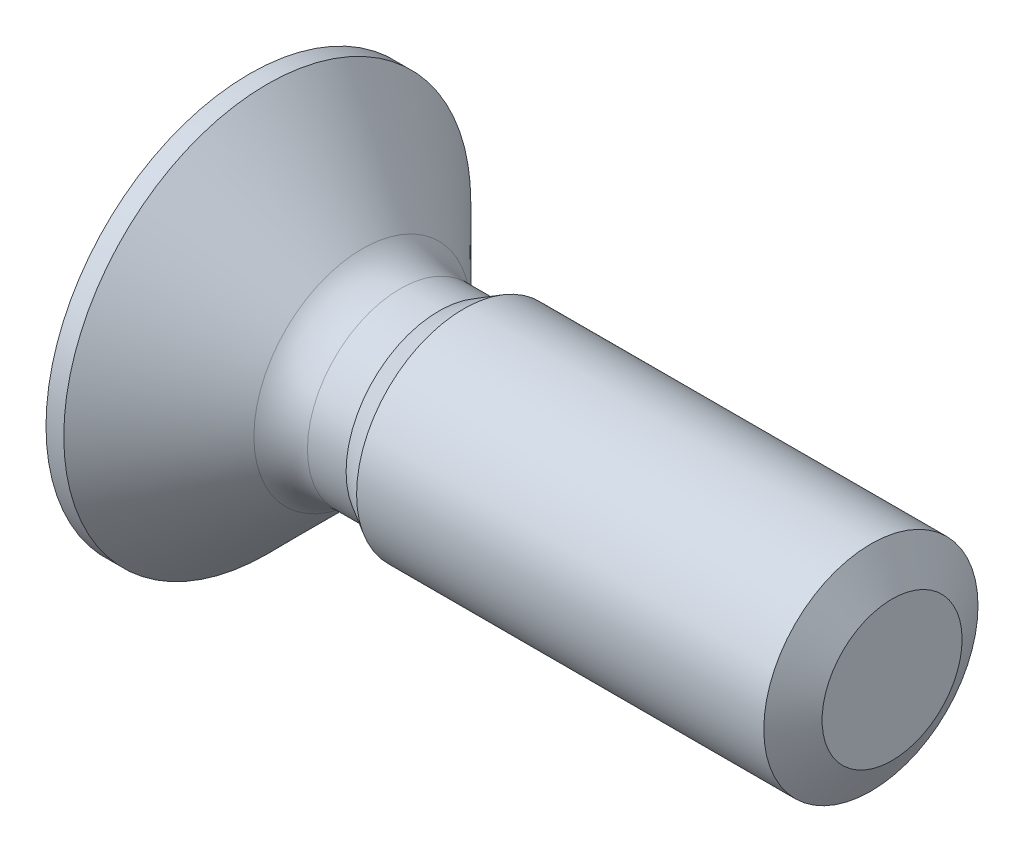
ISO-10303-21;
HEADER;
FILE_DESCRIPTION(('STEP AP214'),'2;1');
FILE_NAME('part.step','',(''),(''),'','','');
FILE_SCHEMA(('AUTOMOTIVE_DESIGN { 1 0 10303 214 1 1 1 1 }'));
ENDSEC;
DATA;
#1=APPLICATION_CONTEXT('core data for automotive mechanical design processes');
#2=APPLICATION_PROTOCOL_DEFINITION('international standard','automotive_design',2000,#1);
#3=PRODUCT_CONTEXT('',#1,'mechanical');
#4=PRODUCT('Part','Part','',(#3));
#5=PRODUCT_RELATED_PRODUCT_CATEGORY('part','',(#4));
#6=PRODUCT_DEFINITION_FORMATION('','',#4);
#7=PRODUCT_DEFINITION_CONTEXT('part definition',#1,'design');
#8=PRODUCT_DEFINITION('design','',#6,#7);
#9=PRODUCT_DEFINITION_SHAPE('','',#8);
#10=(LENGTH_UNIT() NAMED_UNIT(*) SI_UNIT(.MILLI.,.METRE.));
#11=(NAMED_UNIT(*) PLANE_ANGLE_UNIT() SI_UNIT($,.RADIAN.));
#12=(NAMED_UNIT(*) SI_UNIT($,.STERADIAN.) SOLID_ANGLE_UNIT());
#13=UNCERTAINTY_MEASURE_WITH_UNIT(LENGTH_MEASURE(1.E-05),#10,'distance_accuracy_value','');
#14=(GEOMETRIC_REPRESENTATION_CONTEXT(3) GLOBAL_UNCERTAINTY_ASSIGNED_CONTEXT((#13)) GLOBAL_UNIT_ASSIGNED_CONTEXT((#10,
#11,#12)) REPRESENTATION_CONTEXT('',''));
#15=CARTESIAN_POINT('',(0.,0.,0.));
#16=DIRECTION('',(0.,0.,1.));
#17=DIRECTION('',(1.,0.,0.));
#18=AXIS2_PLACEMENT_3D('',#15,#16,#17);
#19=CARTESIAN_POINT('',(0.,0.,0.));
#20=DIRECTION('',(1.,0.,0.));
#21=DIRECTION('',(0.,0.,-1.));
#22=AXIS2_PLACEMENT_3D('',#19,#20,#21);
#23=PLANE('',#22);
#24=CARTESIAN_POINT('',(0.,0.,0.));
#25=DIRECTION('',(-1.,0.,0.));
#26=DIRECTION('',(0.,0.,1.));
#27=AXIS2_PLACEMENT_3D('',#24,#25,#26);
#28=CIRCLE('',#27,1.9);
#29=CARTESIAN_POINT('',(0.,0.,1.9));
#30=VERTEX_POINT('',#29);
#31=EDGE_CURVE('E183',#30,#30,#28,.T.);
#32=ORIENTED_EDGE('',*,*,#31,.T.);
#33=EDGE_LOOP('',(#32));
#34=FACE_BOUND('',#33,.T.);
#35=DIRECTION('',(0.,1.,0.));
#36=VECTOR('',#35,1.);
#37=CARTESIAN_POINT('',(0.,0.95,0.200000000000003));
#38=LINE('',#37,#36);
#39=CARTESIAN_POINT('',(0.,0.2,0.200000000000001));
#40=VERTEX_POINT('',#39);
#41=CARTESIAN_POINT('',(0.,0.95,0.200000000000003));
#42=VERTEX_POINT('',#41);
#43=EDGE_CURVE('E105',#40,#42,#38,.T.);
#44=ORIENTED_EDGE('',*,*,#43,.F.);
#45=DIRECTION('',(0.,0.,-1.));
#46=VECTOR('',#45,1.);
#47=CARTESIAN_POINT('',(0.,0.2,-0.95));
#48=LINE('',#47,#46);
#49=CARTESIAN_POINT('',(0.,0.2,0.95));
#50=VERTEX_POINT('',#49);
#51=EDGE_CURVE('E150',#50,#40,#48,.T.);
#52=ORIENTED_EDGE('',*,*,#51,.F.);
#53=DIRECTION('',(0.,1.,0.));
#54=VECTOR('',#53,1.);
#55=CARTESIAN_POINT('',(0.,0.2,0.95));
#56=LINE('',#55,#54);
#57=CARTESIAN_POINT('',(0.,-0.2,0.95));
#58=VERTEX_POINT('',#57);
#59=EDGE_CURVE('E147',#58,#50,#56,.T.);
#60=ORIENTED_EDGE('',*,*,#59,.F.);
#61=DIRECTION('',(0.,0.,1.));
#62=VECTOR('',#61,1.);
#63=CARTESIAN_POINT('',(0.,-0.2,-0.95));
#64=LINE('',#63,#62);
#65=CARTESIAN_POINT('',(0.,-0.2,0.199999999999999));
#66=VERTEX_POINT('',#65);
#67=EDGE_CURVE('E78',#66,#58,#64,.T.);
#68=ORIENTED_EDGE('',*,*,#67,.F.);
#69=CARTESIAN_POINT('',(0.,-0.950000000000001,0.199999999999997));
#70=VERTEX_POINT('',#69);
#71=EDGE_CURVE('E113',#70,#66,#38,.T.);
#72=ORIENTED_EDGE('',*,*,#71,.F.);
#73=DIRECTION('',(0.,0.,1.));
#74=VECTOR('',#73,1.);
#75=CARTESIAN_POINT('',(0.,-0.950000000000001,0.199999999999997));
#76=LINE('',#75,#74);
#77=CARTESIAN_POINT('',(0.,-0.95,-0.200000000000003));
#78=VERTEX_POINT('',#77);
#79=EDGE_CURVE('E114',#78,#70,#76,.T.);
#80=ORIENTED_EDGE('',*,*,#79,.F.);
#81=DIRECTION('',(0.,-1.,0.));
#82=VECTOR('',#81,1.);
#83=CARTESIAN_POINT('',(0.,0.950000000000001,-0.199999999999997));
#84=LINE('',#83,#82);
#85=CARTESIAN_POINT('',(0.,-0.2,-0.200000000000001));
#86=VERTEX_POINT('',#85);
#87=EDGE_CURVE('E127',#86,#78,#84,.T.);
#88=ORIENTED_EDGE('',*,*,#87,.F.);
#89=CARTESIAN_POINT('',(0.,-0.2,-0.95));
#90=VERTEX_POINT('',#89);
#91=EDGE_CURVE('E144',#90,#86,#64,.T.);
#92=ORIENTED_EDGE('',*,*,#91,.F.);
#93=DIRECTION('',(0.,-1.,0.));
#94=VECTOR('',#93,1.);
#95=CARTESIAN_POINT('',(0.,0.2,-0.95));
#96=LINE('',#95,#94);
#97=CARTESIAN_POINT('',(0.,0.2,-0.95));
#98=VERTEX_POINT('',#97);
#99=EDGE_CURVE('E55',#98,#90,#96,.T.);
#100=ORIENTED_EDGE('',*,*,#99,.F.);
#101=CARTESIAN_POINT('',(0.,0.2,-0.199999999999999));
#102=VERTEX_POINT('',#101);
#103=EDGE_CURVE('E153',#102,#98,#48,.T.);
#104=ORIENTED_EDGE('',*,*,#103,.F.);
#105=CARTESIAN_POINT('',(0.,0.950000000000001,-0.199999999999997));
#106=VERTEX_POINT('',#105);
#107=EDGE_CURVE('E126',#106,#102,#84,.T.);
#108=ORIENTED_EDGE('',*,*,#107,.F.);
#109=DIRECTION('',(0.,0.,-1.));
#110=VECTOR('',#109,1.);
#111=CARTESIAN_POINT('',(0.,0.95,0.200000000000003));
#112=LINE('',#111,#110);
#113=EDGE_CURVE('E119',#42,#106,#112,.T.);
#114=ORIENTED_EDGE('',*,*,#113,.F.);
#115=EDGE_LOOP('',(#44,#52,#60,#68,#72,#80,#88,#92,#100,#104,#108,#114));
#116=FACE_BOUND('',#115,.T.);
#117=ADVANCED_FACE('F41',(#34,#116),#23,.F.);
#118=CARTESIAN_POINT('',(1.2,0.,0.));
#119=DIRECTION('',(-0.164398987305357,-0.986393923832144,0.));
#120=DIRECTION('',(0.986393923832144,-0.164398987305357,0.));
#121=AXIS2_PLACEMENT_3D('',#118,#119,#120);
#122=PLANE('',#121);
#123=ORIENTED_EDGE('',*,*,#51,.T.);
#124=DIRECTION('',(0.973328526784575,-0.162221421130763,-0.162221421130763));
#125=VECTOR('',#124,1.);
#126=CARTESIAN_POINT('',(1.2,0.,0.));
#127=LINE('',#126,#125);
#128=CARTESIAN_POINT('',(1.2,0.,0.));
#129=VERTEX_POINT('',#128);
#130=EDGE_CURVE('E84',#40,#129,#127,.T.);
#131=ORIENTED_EDGE('',*,*,#130,.T.);
#132=DIRECTION('',(0.777436258070084,-0.129572709678347,-0.61547037097215));
#133=VECTOR('',#132,1.);
#134=CARTESIAN_POINT('',(0.,0.2,0.95));
#135=LINE('',#134,#133);
#136=EDGE_CURVE('E64',#50,#129,#135,.T.);
#137=ORIENTED_EDGE('',*,*,#136,.F.);
#138=EDGE_LOOP('',(#123,#131,#137));
#139=FACE_BOUND('',#138,.T.);
#140=ADVANCED_FACE('F199',(#139),#122,.T.);
#141=DIRECTION('',(0.777436258070084,-0.129572709678347,0.61547037097215));
#142=VECTOR('',#141,1.);
#143=CARTESIAN_POINT('',(0.,0.2,-0.95));
#144=LINE('',#143,#142);
#145=EDGE_CURVE('E149',#98,#129,#144,.T.);
#146=ORIENTED_EDGE('',*,*,#145,.T.);
#147=DIRECTION('',(-0.973328526784575,0.162221421130763,-0.162221421130762));
#148=VECTOR('',#147,1.);
#149=CARTESIAN_POINT('',(1.2,0.,0.));
#150=LINE('',#149,#148);
#151=EDGE_CURVE('E131',#129,#102,#150,.T.);
#152=ORIENTED_EDGE('',*,*,#151,.T.);
#153=ORIENTED_EDGE('',*,*,#103,.T.);
#154=EDGE_LOOP('',(#146,#152,#153));
#155=FACE_BOUND('',#154,.T.);
#156=ADVANCED_FACE('F193',(#155),#122,.T.);
#157=CARTESIAN_POINT('',(1.2,0.,0.));
#158=DIRECTION('',(-0.164398987305357,0.986393923832144,0.));
#159=DIRECTION('',(-0.986393923832144,-0.164398987305357,0.));
#160=AXIS2_PLACEMENT_3D('',#157,#158,#159);
#161=PLANE('',#160);
#162=DIRECTION('',(0.777436258070084,0.129572709678347,-0.61547037097215));
#163=VECTOR('',#162,1.);
#164=CARTESIAN_POINT('',(0.,-0.2,0.95));
#165=LINE('',#164,#163);
#166=EDGE_CURVE('E143',#58,#129,#165,.T.);
#167=ORIENTED_EDGE('',*,*,#166,.T.);
#168=DIRECTION('',(-0.973328526784575,-0.162221421130763,0.162221421130762));
#169=VECTOR('',#168,1.);
#170=CARTESIAN_POINT('',(1.2,0.,0.));
#171=LINE('',#170,#169);
#172=EDGE_CURVE('E11',#129,#66,#171,.T.);
#173=ORIENTED_EDGE('',*,*,#172,.T.);
#174=ORIENTED_EDGE('',*,*,#67,.T.);
#175=EDGE_LOOP('',(#167,#173,#174));
#176=FACE_BOUND('',#175,.T.);
#177=ADVANCED_FACE('F194',(#176),#161,.T.);
#178=ORIENTED_EDGE('',*,*,#91,.T.);
#179=DIRECTION('',(0.973328526784575,0.162221421130763,0.162221421130763));
#180=VECTOR('',#179,1.);
#181=CARTESIAN_POINT('',(1.2,0.,0.));
#182=LINE('',#181,#180);
#183=EDGE_CURVE('E48',#86,#129,#182,.T.);
#184=ORIENTED_EDGE('',*,*,#183,.T.);
#185=DIRECTION('',(0.777436258070084,0.129572709678347,0.61547037097215));
#186=VECTOR('',#185,1.);
#187=CARTESIAN_POINT('',(0.,-0.2,-0.95));
#188=LINE('',#187,#186);
#189=EDGE_CURVE('E158',#90,#129,#188,.T.);
#190=ORIENTED_EDGE('',*,*,#189,.F.);
#191=EDGE_LOOP('',(#178,#184,#190));
#192=FACE_BOUND('',#191,.T.);
#193=ADVANCED_FACE('F187',(#192),#161,.T.);
#194=CARTESIAN_POINT('',(0.,0.,0.));
#195=DIRECTION('',(-1.,0.,0.));
#196=DIRECTION('',(0.,0.,1.));
#197=AXIS2_PLACEMENT_3D('',#194,#195,#196);
#198=CYLINDRICAL_SURFACE('',#197,1.9);
#199=ORIENTED_EDGE('',*,*,#31,.F.);
#200=EDGE_LOOP('',(#199));
#201=FACE_BOUND('',#200,.T.);
#202=CARTESIAN_POINT('',(0.166000000000004,0.,0.));
#203=DIRECTION('',(-1.,0.,0.));
#204=DIRECTION('',(0.,0.,1.));
#205=AXIS2_PLACEMENT_3D('',#202,#203,#204);
#206=CIRCLE('',#205,1.9);
#207=CARTESIAN_POINT('',(0.166000000000004,0.,1.9));
#208=VERTEX_POINT('',#207);
#209=EDGE_CURVE('E179',#208,#208,#206,.T.);
#210=ORIENTED_EDGE('',*,*,#209,.T.);
#211=EDGE_LOOP('',(#210));
#212=FACE_BOUND('',#211,.T.);
#213=ADVANCED_FACE('F227',(#201,#212),#198,.T.);
#214=CARTESIAN_POINT('',(1.05355339059327,0.,0.));
#215=DIRECTION('',(-1.,0.,0.));
#216=DIRECTION('',(0.,0.,1.));
#217=AXIS2_PLACEMENT_3D('',#214,#215,#216);
#218=CONICAL_SURFACE('',#217,1.01244660940673,0.78539816339745);
#219=ORIENTED_EDGE('',*,*,#209,.F.);
#220=EDGE_LOOP('',(#219));
#221=FACE_BOUND('',#220,.T.);
#222=CARTESIAN_POINT('',(1.05355339059327,0.,0.));
#223=DIRECTION('',(-1.,0.,0.));
#224=DIRECTION('',(0.,0.,1.));
#225=AXIS2_PLACEMENT_3D('',#222,#223,#224);
#226=CIRCLE('',#225,1.01244660940673);
#227=CARTESIAN_POINT('',(1.05355339059327,0.,1.01244660940673));
#228=VERTEX_POINT('',#227);
#229=EDGE_CURVE('E175',#228,#228,#226,.T.);
#230=ORIENTED_EDGE('',*,*,#229,.T.);
#231=EDGE_LOOP('',(#230));
#232=FACE_BOUND('',#231,.T.);
#233=ADVANCED_FACE('F230',(#221,#232),#218,.T.);
#234=CARTESIAN_POINT('',(1.40710678118655,0.,0.));
#235=DIRECTION('',(-1.,0.,0.));
#236=DIRECTION('',(0.,0.,1.));
#237=AXIS2_PLACEMENT_3D('',#234,#235,#236);
#238=TOROIDAL_SURFACE('',#237,1.366,0.5);
#239=ORIENTED_EDGE('',*,*,#229,.F.);
#240=EDGE_LOOP('',(#239));
#241=FACE_BOUND('',#240,.T.);
#242=CARTESIAN_POINT('',(1.40710678118655,0.,0.));
#243=DIRECTION('',(-1.,0.,0.));
#244=DIRECTION('',(0.,0.,1.));
#245=AXIS2_PLACEMENT_3D('',#242,#243,#244);
#246=CIRCLE('',#245,0.866);
#247=CARTESIAN_POINT('',(1.40710678118655,0.,0.866));
#248=VERTEX_POINT('',#247);
#249=EDGE_CURVE('E172',#248,#248,#246,.T.);
#250=ORIENTED_EDGE('',*,*,#249,.T.);
#251=EDGE_LOOP('',(#250));
#252=FACE_BOUND('',#251,.T.);
#253=ADVANCED_FACE('F235',(#241,#252),#238,.F.);
#254=CARTESIAN_POINT('',(0.,0.,0.));
#255=DIRECTION('',(-1.,0.,0.));
#256=DIRECTION('',(0.,0.,1.));
#257=AXIS2_PLACEMENT_3D('',#254,#255,#256);
#258=CYLINDRICAL_SURFACE('',#257,0.866);
#259=ORIENTED_EDGE('',*,*,#249,.F.);
#260=EDGE_LOOP('',(#259));
#261=FACE_BOUND('',#260,.T.);
#262=CARTESIAN_POINT('',(1.76790519178577,0.,0.));
#263=DIRECTION('',(-1.,0.,0.));
#264=DIRECTION('',(0.,0.,1.));
#265=AXIS2_PLACEMENT_3D('',#262,#263,#264);
#266=CIRCLE('',#265,0.866);
#267=CARTESIAN_POINT('',(1.76790519178577,0.,0.866));
#268=VERTEX_POINT('',#267);
#269=EDGE_CURVE('E169',#268,#268,#266,.T.);
#270=ORIENTED_EDGE('',*,*,#269,.T.);
#271=EDGE_LOOP('',(#270));
#272=FACE_BOUND('',#271,.T.);
#273=ADVANCED_FACE('F241',(#261,#272),#258,.T.);
#274=CARTESIAN_POINT('',(2.,0.,0.));
#275=DIRECTION('',(1.,0.,0.));
#276=DIRECTION('',(0.,0.,-1.));
#277=AXIS2_PLACEMENT_3D('',#274,#275,#276);
#278=CONICAL_SURFACE('',#277,1.,0.5235987755983);
#279=ORIENTED_EDGE('',*,*,#269,.F.);
#280=EDGE_LOOP('',(#279));
#281=FACE_BOUND('',#280,.T.);
#282=CARTESIAN_POINT('',(2.,0.,0.));
#283=DIRECTION('',(-1.,0.,0.));
#284=DIRECTION('',(0.,0.,1.));
#285=AXIS2_PLACEMENT_3D('',#282,#283,#284);
#286=CIRCLE('',#285,1.);
#287=CARTESIAN_POINT('',(2.,0.,1.));
#288=VERTEX_POINT('',#287);
#289=EDGE_CURVE('E166',#288,#288,#286,.T.);
#290=ORIENTED_EDGE('',*,*,#289,.T.);
#291=EDGE_LOOP('',(#290));
#292=FACE_BOUND('',#291,.T.);
#293=ADVANCED_FACE('F247',(#281,#292),#278,.T.);
#294=CARTESIAN_POINT('',(0.,0.,0.));
#295=DIRECTION('',(-1.,0.,0.));
#296=DIRECTION('',(0.,0.,1.));
#297=AXIS2_PLACEMENT_3D('',#294,#295,#296);
#298=CYLINDRICAL_SURFACE('',#297,1.);
#299=CARTESIAN_POINT('',(5.802166402297,0.,0.));
#300=DIRECTION('',(1.,0.,0.));
#301=DIRECTION('',(0.,0.,-1.));
#302=AXIS2_PLACEMENT_3D('',#299,#300,#301);
#303=CIRCLE('',#302,1.);
#304=CARTESIAN_POINT('',(5.802166402297,0.,-1.));
#305=VERTEX_POINT('',#304);
#306=EDGE_CURVE('E163',#305,#305,#303,.T.);
#307=ORIENTED_EDGE('',*,*,#306,.F.);
#308=EDGE_LOOP('',(#307));
#309=FACE_BOUND('',#308,.T.);
#310=ORIENTED_EDGE('',*,*,#289,.F.);
#311=EDGE_LOOP('',(#310));
#312=FACE_BOUND('',#311,.T.);
#313=ADVANCED_FACE('F253',(#309,#312),#298,.T.);
#314=CARTESIAN_POINT('',(5.802166402297,0.,0.));
#315=DIRECTION('',(-1.,0.,0.));
#316=DIRECTION('',(0.,0.,1.));
#317=AXIS2_PLACEMENT_3D('',#314,#315,#316);
#318=CONICAL_SURFACE('',#317,1.,1.05188801855137);
#319=CARTESIAN_POINT('',(6.,0.,0.));
#320=DIRECTION('',(1.,0.,0.));
#321=DIRECTION('',(0.,0.,-1.));
#322=AXIS2_PLACEMENT_3D('',#319,#320,#321);
#323=CIRCLE('',#322,0.6536);
#324=CARTESIAN_POINT('',(6.,0.,-0.6536));
#325=VERTEX_POINT('',#324);
#326=EDGE_CURVE('E152',#325,#325,#323,.T.);
#327=ORIENTED_EDGE('',*,*,#326,.F.);
#328=EDGE_LOOP('',(#327));
#329=FACE_BOUND('',#328,.T.);
#330=ORIENTED_EDGE('',*,*,#306,.T.);
#331=EDGE_LOOP('',(#330));
#332=FACE_BOUND('',#331,.T.);
#333=ADVANCED_FACE('F258',(#329,#332),#318,.T.);
#334=CARTESIAN_POINT('',(6.,1.,0.));
#335=DIRECTION('',(-1.,0.,0.));
#336=DIRECTION('',(0.,0.,1.));
#337=AXIS2_PLACEMENT_3D('',#334,#335,#336);
#338=PLANE('',#337);
#339=ORIENTED_EDGE('',*,*,#326,.T.);
#340=EDGE_LOOP('',(#339));
#341=FACE_BOUND('',#340,.T.);
#342=ADVANCED_FACE('F264',(#341),#338,.F.);
#343=CARTESIAN_POINT('',(0.,0.2,-0.95));
#344=DIRECTION('',(0.620702944365561,0.,-0.784045824461761));
#345=DIRECTION('',(-0.784045824461762,0.,-0.620702944365561));
#346=AXIS2_PLACEMENT_3D('',#343,#344,#345);
#347=PLANE('',#346);
#348=ORIENTED_EDGE('',*,*,#145,.F.);
#349=ORIENTED_EDGE('',*,*,#99,.T.);
#350=ORIENTED_EDGE('',*,*,#189,.T.);
#351=EDGE_LOOP('',(#348,#349,#350));
#352=FACE_BOUND('',#351,.T.);
#353=ADVANCED_FACE('F191',(#352),#347,.F.);
#354=CARTESIAN_POINT('',(0.,-0.2,0.95));
#355=DIRECTION('',(0.620702944365561,0.,0.784045824461761));
#356=DIRECTION('',(0.784045824461762,0.,-0.620702944365561));
#357=AXIS2_PLACEMENT_3D('',#354,#355,#356);
#358=PLANE('',#357);
#359=ORIENTED_EDGE('',*,*,#166,.F.);
#360=ORIENTED_EDGE('',*,*,#59,.T.);
#361=ORIENTED_EDGE('',*,*,#136,.T.);
#362=EDGE_LOOP('',(#359,#360,#361));
#363=FACE_BOUND('',#362,.T.);
#364=ADVANCED_FACE('F198',(#363),#358,.F.);
#365=CARTESIAN_POINT('',(1.2,0.,0.));
#366=DIRECTION('',(-0.164398987305357,0.,-0.986393923832144));
#367=DIRECTION('',(0.986393923832144,0.,-0.164398987305357));
#368=AXIS2_PLACEMENT_3D('',#365,#366,#367);
#369=PLANE('',#368);
#370=DIRECTION('',(0.777436258070084,0.615470370972151,-0.129572709678345));
#371=VECTOR('',#370,1.);
#372=CARTESIAN_POINT('',(0.,-0.950000000000001,0.199999999999997));
#373=LINE('',#372,#371);
#374=EDGE_CURVE('E123',#70,#129,#373,.T.);
#375=ORIENTED_EDGE('',*,*,#374,.F.);
#376=ORIENTED_EDGE('',*,*,#71,.T.);
#377=ORIENTED_EDGE('',*,*,#172,.F.);
#378=EDGE_LOOP('',(#375,#376,#377));
#379=FACE_BOUND('',#378,.T.);
#380=ADVANCED_FACE('F203',(#379),#369,.T.);
#381=CARTESIAN_POINT('',(1.2,0.,0.));
#382=DIRECTION('',(-0.164398987305357,0.,0.986393923832144));
#383=DIRECTION('',(-0.986393923832144,0.,-0.164398987305357));
#384=AXIS2_PLACEMENT_3D('',#381,#382,#383);
#385=PLANE('',#384);
#386=ORIENTED_EDGE('',*,*,#87,.T.);
#387=DIRECTION('',(0.777436258070084,0.61547037097215,0.12957270967835));
#388=VECTOR('',#387,1.);
#389=CARTESIAN_POINT('',(0.,-0.95,-0.200000000000003));
#390=LINE('',#389,#388);
#391=EDGE_CURVE('E137',#78,#129,#390,.T.);
#392=ORIENTED_EDGE('',*,*,#391,.T.);
#393=ORIENTED_EDGE('',*,*,#183,.F.);
#394=EDGE_LOOP('',(#386,#392,#393));
#395=FACE_BOUND('',#394,.T.);
#396=ADVANCED_FACE('F207',(#395),#385,.T.);
#397=CARTESIAN_POINT('',(0.,-0.95,-0.200000000000003));
#398=DIRECTION('',(0.620702944365561,-0.784045824461761,0.));
#399=DIRECTION('',(0.784045824461762,0.620702944365561,0.));
#400=AXIS2_PLACEMENT_3D('',#397,#398,#399);
#401=PLANE('',#400);
#402=ORIENTED_EDGE('',*,*,#391,.F.);
#403=ORIENTED_EDGE('',*,*,#79,.T.);
#404=ORIENTED_EDGE('',*,*,#374,.T.);
#405=EDGE_LOOP('',(#402,#403,#404));
#406=FACE_BOUND('',#405,.T.);
#407=ADVANCED_FACE('F206',(#406),#401,.F.);
#408=ORIENTED_EDGE('',*,*,#43,.T.);
#409=DIRECTION('',(0.777436258070084,-0.61547037097215,-0.12957270967835));
#410=VECTOR('',#409,1.);
#411=CARTESIAN_POINT('',(0.,0.95,0.200000000000003));
#412=LINE('',#411,#410);
#413=EDGE_CURVE('E108',#42,#129,#412,.T.);
#414=ORIENTED_EDGE('',*,*,#413,.T.);
#415=ORIENTED_EDGE('',*,*,#130,.F.);
#416=EDGE_LOOP('',(#408,#414,#415));
#417=FACE_BOUND('',#416,.T.);
#418=ADVANCED_FACE('F107',(#417),#369,.T.);
#419=DIRECTION('',(0.777436258070084,-0.615470370972151,0.129572709678345));
#420=VECTOR('',#419,1.);
#421=CARTESIAN_POINT('',(0.,0.950000000000001,-0.199999999999997));
#422=LINE('',#421,#420);
#423=EDGE_CURVE('E121',#106,#129,#422,.T.);
#424=ORIENTED_EDGE('',*,*,#423,.F.);
#425=ORIENTED_EDGE('',*,*,#107,.T.);
#426=ORIENTED_EDGE('',*,*,#151,.F.);
#427=EDGE_LOOP('',(#424,#425,#426));
#428=FACE_BOUND('',#427,.T.);
#429=ADVANCED_FACE('F210',(#428),#385,.T.);
#430=CARTESIAN_POINT('',(0.,0.95,0.200000000000003));
#431=DIRECTION('',(0.620702944365561,0.784045824461761,0.));
#432=DIRECTION('',(-0.784045824461762,0.620702944365561,0.));
#433=AXIS2_PLACEMENT_3D('',#430,#431,#432);
#434=PLANE('',#433);
#435=ORIENTED_EDGE('',*,*,#413,.F.);
#436=ORIENTED_EDGE('',*,*,#113,.T.);
#437=ORIENTED_EDGE('',*,*,#423,.T.);
#438=EDGE_LOOP('',(#435,#436,#437));
#439=FACE_BOUND('',#438,.T.);
#440=ADVANCED_FACE('F118',(#439),#434,.F.);
#441=CLOSED_SHELL('',(#117,#140,#156,#177,#193,#213,#233,#253,#273,#293,#313,#333,#342,#353,
#364,#380,#396,#407,#418,#429,#440));
#442=MANIFOLD_SOLID_BREP('B2',#441);
#443=ADVANCED_BREP_SHAPE_REPRESENTATION('',(#18,#442),#14);
#444=SHAPE_DEFINITION_REPRESENTATION(#9,#443);
ENDSEC;
END-ISO-10303-21;
